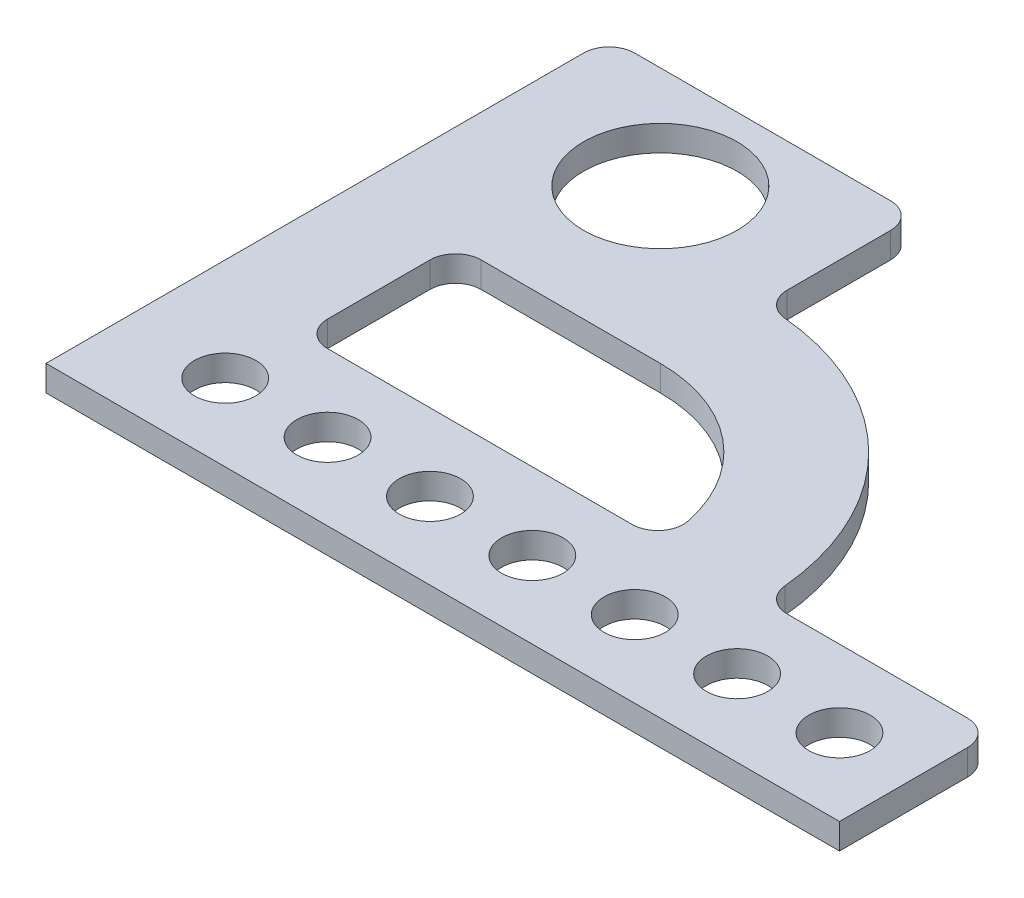
ISO-10303-21;
HEADER;
FILE_DESCRIPTION(('STEP AP214'),'2;1');
FILE_NAME('part.step','',(''),(''),'','','');
FILE_SCHEMA(('AUTOMOTIVE_DESIGN { 1 0 10303 214 1 1 1 1 }'));
ENDSEC;
DATA;
#1=APPLICATION_CONTEXT('core data for automotive mechanical design processes');
#2=APPLICATION_PROTOCOL_DEFINITION('international standard','automotive_design',2000,#1);
#3=PRODUCT_CONTEXT('',#1,'mechanical');
#4=PRODUCT('Part','Part','',(#3));
#5=PRODUCT_RELATED_PRODUCT_CATEGORY('part','',(#4));
#6=PRODUCT_DEFINITION_FORMATION('','',#4);
#7=PRODUCT_DEFINITION_CONTEXT('part definition',#1,'design');
#8=PRODUCT_DEFINITION('design','',#6,#7);
#9=PRODUCT_DEFINITION_SHAPE('','',#8);
#10=(LENGTH_UNIT() NAMED_UNIT(*) SI_UNIT(.MILLI.,.METRE.));
#11=(NAMED_UNIT(*) PLANE_ANGLE_UNIT() SI_UNIT($,.RADIAN.));
#12=(NAMED_UNIT(*) SI_UNIT($,.STERADIAN.) SOLID_ANGLE_UNIT());
#13=UNCERTAINTY_MEASURE_WITH_UNIT(LENGTH_MEASURE(1.E-05),#10,'distance_accuracy_value','');
#14=(GEOMETRIC_REPRESENTATION_CONTEXT(3) GLOBAL_UNCERTAINTY_ASSIGNED_CONTEXT((#13)) GLOBAL_UNIT_ASSIGNED_CONTEXT((#10,
#11,#12)) REPRESENTATION_CONTEXT('',''));
#15=CARTESIAN_POINT('',(0.,0.,0.));
#16=DIRECTION('',(0.,0.,1.));
#17=DIRECTION('',(1.,0.,0.));
#18=AXIS2_PLACEMENT_3D('',#15,#16,#17);
#19=CARTESIAN_POINT('',(0.,5.,-30.));
#20=DIRECTION('',(0.,0.,-1.));
#21=DIRECTION('',(-1.,0.,0.));
#22=AXIS2_PLACEMENT_3D('',#19,#20,#21);
#23=PLANE('',#22);
#24=DIRECTION('',(1.,0.,0.));
#25=VECTOR('',#24,1.);
#26=CARTESIAN_POINT('',(0.,0.,-30.));
#27=LINE('',#26,#25);
#28=CARTESIAN_POINT('',(114.772255750517,0.,-30.));
#29=VERTEX_POINT('',#28);
#30=CARTESIAN_POINT('',(150.,0.,-30.));
#31=VERTEX_POINT('',#30);
#32=EDGE_CURVE('E272',#29,#31,#27,.T.);
#33=ORIENTED_EDGE('',*,*,#32,.F.);
#34=DIRECTION('',(0.,-1.,0.));
#35=VECTOR('',#34,1.);
#36=CARTESIAN_POINT('',(114.772255750517,5.,-30.));
#37=LINE('',#36,#35);
#38=CARTESIAN_POINT('',(114.772255750517,5.,-30.));
#39=VERTEX_POINT('',#38);
#40=EDGE_CURVE('E11',#39,#29,#37,.T.);
#41=ORIENTED_EDGE('',*,*,#40,.F.);
#42=DIRECTION('',(1.,0.,0.));
#43=VECTOR('',#42,1.);
#44=CARTESIAN_POINT('',(0.,5.,-30.));
#45=LINE('',#44,#43);
#46=CARTESIAN_POINT('',(150.,5.,-30.));
#47=VERTEX_POINT('',#46);
#48=EDGE_CURVE('E687',#39,#47,#45,.T.);
#49=ORIENTED_EDGE('',*,*,#48,.T.);
#50=DIRECTION('',(0.,-1.,0.));
#51=VECTOR('',#50,1.);
#52=CARTESIAN_POINT('',(150.,5.,-30.));
#53=LINE('',#52,#51);
#54=EDGE_CURVE('E128',#47,#31,#53,.T.);
#55=ORIENTED_EDGE('',*,*,#54,.T.);
#56=EDGE_LOOP('',(#33,#41,#49,#55));
#57=FACE_BOUND('',#56,.T.);
#58=ADVANCED_FACE('F41',(#57),#23,.T.);
#59=CARTESIAN_POINT('',(114.772255750517,5.,-35.));
#60=DIRECTION('',(0.,-1.,0.));
#61=DIRECTION('',(0.,0.,-1.));
#62=AXIS2_PLACEMENT_3D('',#59,#60,#61);
#63=CYLINDRICAL_SURFACE('',#62,5.);
#64=CARTESIAN_POINT('',(114.772255750517,0.,-35.));
#65=DIRECTION('',(0.,1.,0.));
#66=DIRECTION('',(0.,0.,1.));
#67=AXIS2_PLACEMENT_3D('',#64,#65,#66);
#68=CIRCLE('',#67,5.);
#69=CARTESIAN_POINT('',(109.792959773197,0.,-34.5454545454545));
#70=VERTEX_POINT('',#69);
#71=EDGE_CURVE('E276',#29,#70,#68,.F.);
#72=ORIENTED_EDGE('',*,*,#71,.T.);
#73=DIRECTION('',(0.,-1.,0.));
#74=VECTOR('',#73,1.);
#75=CARTESIAN_POINT('',(109.792959773197,5.,-34.5454545454545));
#76=LINE('',#75,#74);
#77=CARTESIAN_POINT('',(109.792959773197,5.,-34.5454545454545));
#78=VERTEX_POINT('',#77);
#79=EDGE_CURVE('E52',#78,#70,#76,.T.);
#80=ORIENTED_EDGE('',*,*,#79,.F.);
#81=CARTESIAN_POINT('',(114.772255750517,5.,-35.));
#82=DIRECTION('',(0.,1.,0.));
#83=DIRECTION('',(0.,0.,1.));
#84=AXIS2_PLACEMENT_3D('',#81,#82,#83);
#85=CIRCLE('',#84,5.);
#86=EDGE_CURVE('E683',#39,#78,#85,.F.);
#87=ORIENTED_EDGE('',*,*,#86,.F.);
#88=ORIENTED_EDGE('',*,*,#40,.T.);
#89=EDGE_LOOP('',(#72,#80,#87,#88));
#90=FACE_BOUND('',#89,.T.);
#91=ADVANCED_FACE('F405',(#90),#63,.F.);
#92=CARTESIAN_POINT('',(60.,5.,-30.));
#93=DIRECTION('',(0.,-1.,0.));
#94=DIRECTION('',(0.,0.,-1.));
#95=AXIS2_PLACEMENT_3D('',#92,#93,#94);
#96=CYLINDRICAL_SURFACE('',#95,50.);
#97=CARTESIAN_POINT('',(60.,0.,-30.));
#98=DIRECTION('',(0.,1.,0.));
#99=DIRECTION('',(0.,0.,1.));
#100=AXIS2_PLACEMENT_3D('',#97,#98,#99);
#101=CIRCLE('',#100,50.);
#102=CARTESIAN_POINT('',(64.5454545454545,0.,-79.7929597731969));
#103=VERTEX_POINT('',#102);
#104=EDGE_CURVE('E280',#103,#70,#101,.F.);
#105=ORIENTED_EDGE('',*,*,#104,.F.);
#106=DIRECTION('',(0.,-1.,0.));
#107=VECTOR('',#106,1.);
#108=CARTESIAN_POINT('',(64.5454545454545,5.,-79.7929597731969));
#109=LINE('',#108,#107);
#110=CARTESIAN_POINT('',(64.5454545454545,5.,-79.7929597731969));
#111=VERTEX_POINT('',#110);
#112=EDGE_CURVE('E339',#111,#103,#109,.T.);
#113=ORIENTED_EDGE('',*,*,#112,.F.);
#114=CARTESIAN_POINT('',(60.,5.,-30.));
#115=DIRECTION('',(0.,1.,0.));
#116=DIRECTION('',(0.,0.,1.));
#117=AXIS2_PLACEMENT_3D('',#114,#115,#116);
#118=CIRCLE('',#117,50.);
#119=EDGE_CURVE('E680',#111,#78,#118,.F.);
#120=ORIENTED_EDGE('',*,*,#119,.T.);
#121=ORIENTED_EDGE('',*,*,#79,.T.);
#122=EDGE_LOOP('',(#105,#113,#120,#121));
#123=FACE_BOUND('',#122,.T.);
#124=ADVANCED_FACE('F410',(#123),#96,.T.);
#125=CARTESIAN_POINT('',(65.,5.,-84.7722557505166));
#126=DIRECTION('',(0.,-1.,0.));
#127=DIRECTION('',(0.,0.,-1.));
#128=AXIS2_PLACEMENT_3D('',#125,#126,#127);
#129=CYLINDRICAL_SURFACE('',#128,5.);
#130=CARTESIAN_POINT('',(65.,0.,-84.7722557505166));
#131=DIRECTION('',(0.,1.,0.));
#132=DIRECTION('',(0.,0.,1.));
#133=AXIS2_PLACEMENT_3D('',#130,#131,#132);
#134=CIRCLE('',#133,5.);
#135=CARTESIAN_POINT('',(60.,0.,-84.7722557505166));
#136=VERTEX_POINT('',#135);
#137=EDGE_CURVE('E284',#103,#136,#134,.F.);
#138=ORIENTED_EDGE('',*,*,#137,.T.);
#139=DIRECTION('',(0.,-1.,0.));
#140=VECTOR('',#139,1.);
#141=CARTESIAN_POINT('',(60.,5.,-84.7722557505166));
#142=LINE('',#141,#140);
#143=CARTESIAN_POINT('',(60.,5.,-84.7722557505166));
#144=VERTEX_POINT('',#143);
#145=EDGE_CURVE('E335',#144,#136,#142,.T.);
#146=ORIENTED_EDGE('',*,*,#145,.F.);
#147=CARTESIAN_POINT('',(65.,5.,-84.7722557505166));
#148=DIRECTION('',(0.,1.,0.));
#149=DIRECTION('',(0.,0.,1.));
#150=AXIS2_PLACEMENT_3D('',#147,#148,#149);
#151=CIRCLE('',#150,5.);
#152=EDGE_CURVE('E676',#111,#144,#151,.F.);
#153=ORIENTED_EDGE('',*,*,#152,.F.);
#154=ORIENTED_EDGE('',*,*,#112,.T.);
#155=EDGE_LOOP('',(#138,#146,#153,#154));
#156=FACE_BOUND('',#155,.T.);
#157=ADVANCED_FACE('F628',(#156),#129,.F.);
#158=CARTESIAN_POINT('',(60.,5.,0.));
#159=DIRECTION('',(-1.,0.,0.));
#160=DIRECTION('',(0.,0.,1.));
#161=AXIS2_PLACEMENT_3D('',#158,#159,#160);
#162=PLANE('',#161);
#163=DIRECTION('',(0.,0.,-1.));
#164=VECTOR('',#163,1.);
#165=CARTESIAN_POINT('',(60.,0.,0.));
#166=LINE('',#165,#164);
#167=CARTESIAN_POINT('',(60.,0.,-105.));
#168=VERTEX_POINT('',#167);
#169=EDGE_CURVE('E288',#136,#168,#166,.T.);
#170=ORIENTED_EDGE('',*,*,#169,.T.);
#171=DIRECTION('',(0.,-1.,0.));
#172=VECTOR('',#171,1.);
#173=CARTESIAN_POINT('',(60.,5.,-105.));
#174=LINE('',#173,#172);
#175=CARTESIAN_POINT('',(60.,5.,-105.));
#176=VERTEX_POINT('',#175);
#177=EDGE_CURVE('E332',#176,#168,#174,.T.);
#178=ORIENTED_EDGE('',*,*,#177,.F.);
#179=DIRECTION('',(0.,0.,-1.));
#180=VECTOR('',#179,1.);
#181=CARTESIAN_POINT('',(60.,5.,0.));
#182=LINE('',#181,#180);
#183=EDGE_CURVE('E679',#144,#176,#182,.T.);
#184=ORIENTED_EDGE('',*,*,#183,.F.);
#185=ORIENTED_EDGE('',*,*,#145,.T.);
#186=EDGE_LOOP('',(#170,#178,#184,#185));
#187=FACE_BOUND('',#186,.T.);
#188=ADVANCED_FACE('F619',(#187),#162,.F.);
#189=CARTESIAN_POINT('',(55.,5.,-105.));
#190=DIRECTION('',(0.,-1.,0.));
#191=DIRECTION('',(0.,0.,-1.));
#192=AXIS2_PLACEMENT_3D('',#189,#190,#191);
#193=CYLINDRICAL_SURFACE('',#192,5.00000000000001);
#194=CARTESIAN_POINT('',(55.,0.,-105.));
#195=DIRECTION('',(0.,1.,0.));
#196=DIRECTION('',(0.,0.,1.));
#197=AXIS2_PLACEMENT_3D('',#194,#195,#196);
#198=CIRCLE('',#197,5.00000000000001);
#199=CARTESIAN_POINT('',(55.,0.,-110.));
#200=VERTEX_POINT('',#199);
#201=EDGE_CURVE('E292',#200,#168,#198,.F.);
#202=ORIENTED_EDGE('',*,*,#201,.F.);
#203=DIRECTION('',(0.,-1.,0.));
#204=VECTOR('',#203,1.);
#205=CARTESIAN_POINT('',(55.,5.,-110.));
#206=LINE('',#205,#204);
#207=CARTESIAN_POINT('',(55.,5.,-110.));
#208=VERTEX_POINT('',#207);
#209=EDGE_CURVE('E329',#208,#200,#206,.T.);
#210=ORIENTED_EDGE('',*,*,#209,.F.);
#211=CARTESIAN_POINT('',(55.,5.,-105.));
#212=DIRECTION('',(0.,1.,0.));
#213=DIRECTION('',(0.,0.,1.));
#214=AXIS2_PLACEMENT_3D('',#211,#212,#213);
#215=CIRCLE('',#214,5.00000000000001);
#216=EDGE_CURVE('E693',#208,#176,#215,.F.);
#217=ORIENTED_EDGE('',*,*,#216,.T.);
#218=ORIENTED_EDGE('',*,*,#177,.T.);
#219=EDGE_LOOP('',(#202,#210,#217,#218));
#220=FACE_BOUND('',#219,.T.);
#221=ADVANCED_FACE('F610',(#220),#193,.T.);
#222=CARTESIAN_POINT('',(0.,5.,-110.));
#223=DIRECTION('',(0.,0.,-1.));
#224=DIRECTION('',(-1.,0.,0.));
#225=AXIS2_PLACEMENT_3D('',#222,#223,#224);
#226=PLANE('',#225);
#227=DIRECTION('',(1.,0.,0.));
#228=VECTOR('',#227,1.);
#229=CARTESIAN_POINT('',(0.,0.,-110.));
#230=LINE('',#229,#228);
#231=CARTESIAN_POINT('',(5.,0.,-110.));
#232=VERTEX_POINT('',#231);
#233=EDGE_CURVE('E296',#232,#200,#230,.T.);
#234=ORIENTED_EDGE('',*,*,#233,.F.);
#235=DIRECTION('',(0.,-1.,0.));
#236=VECTOR('',#235,1.);
#237=CARTESIAN_POINT('',(5.,5.,-110.));
#238=LINE('',#237,#236);
#239=CARTESIAN_POINT('',(5.,5.,-110.));
#240=VERTEX_POINT('',#239);
#241=EDGE_CURVE('E326',#240,#232,#238,.T.);
#242=ORIENTED_EDGE('',*,*,#241,.F.);
#243=DIRECTION('',(1.,0.,0.));
#244=VECTOR('',#243,1.);
#245=CARTESIAN_POINT('',(0.,5.,-110.));
#246=LINE('',#245,#244);
#247=EDGE_CURVE('E697',#240,#208,#246,.T.);
#248=ORIENTED_EDGE('',*,*,#247,.T.);
#249=ORIENTED_EDGE('',*,*,#209,.T.);
#250=EDGE_LOOP('',(#234,#242,#248,#249));
#251=FACE_BOUND('',#250,.T.);
#252=ADVANCED_FACE('F601',(#251),#226,.T.);
#253=CARTESIAN_POINT('',(5.,5.,-105.));
#254=DIRECTION('',(0.,-1.,0.));
#255=DIRECTION('',(0.,0.,-1.));
#256=AXIS2_PLACEMENT_3D('',#253,#254,#255);
#257=CYLINDRICAL_SURFACE('',#256,5.);
#258=CARTESIAN_POINT('',(5.,0.,-105.));
#259=DIRECTION('',(0.,1.,0.));
#260=DIRECTION('',(0.,0.,1.));
#261=AXIS2_PLACEMENT_3D('',#258,#259,#260);
#262=CIRCLE('',#261,5.);
#263=CARTESIAN_POINT('',(0.,0.,-105.));
#264=VERTEX_POINT('',#263);
#265=EDGE_CURVE('E300',#264,#232,#262,.F.);
#266=ORIENTED_EDGE('',*,*,#265,.F.);
#267=DIRECTION('',(0.,-1.,0.));
#268=VECTOR('',#267,1.);
#269=CARTESIAN_POINT('',(0.,5.,-105.));
#270=LINE('',#269,#268);
#271=CARTESIAN_POINT('',(0.,5.,-105.));
#272=VERTEX_POINT('',#271);
#273=EDGE_CURVE('E323',#272,#264,#270,.T.);
#274=ORIENTED_EDGE('',*,*,#273,.F.);
#275=CARTESIAN_POINT('',(5.,5.,-105.));
#276=DIRECTION('',(0.,1.,0.));
#277=DIRECTION('',(0.,0.,1.));
#278=AXIS2_PLACEMENT_3D('',#275,#276,#277);
#279=CIRCLE('',#278,5.);
#280=EDGE_CURVE('E701',#272,#240,#279,.F.);
#281=ORIENTED_EDGE('',*,*,#280,.T.);
#282=ORIENTED_EDGE('',*,*,#241,.T.);
#283=EDGE_LOOP('',(#266,#274,#281,#282));
#284=FACE_BOUND('',#283,.T.);
#285=ADVANCED_FACE('F592',(#284),#257,.T.);
#286=CARTESIAN_POINT('',(0.,5.,0.));
#287=DIRECTION('',(1.,0.,0.));
#288=DIRECTION('',(0.,0.,-1.));
#289=AXIS2_PLACEMENT_3D('',#286,#287,#288);
#290=PLANE('',#289);
#291=DIRECTION('',(0.,0.,1.));
#292=VECTOR('',#291,1.);
#293=CARTESIAN_POINT('',(0.,0.,0.));
#294=LINE('',#293,#292);
#295=CARTESIAN_POINT('',(0.,0.,0.));
#296=VERTEX_POINT('',#295);
#297=EDGE_CURVE('E304',#264,#296,#294,.T.);
#298=ORIENTED_EDGE('',*,*,#297,.T.);
#299=DIRECTION('',(0.,-1.,0.));
#300=VECTOR('',#299,1.);
#301=CARTESIAN_POINT('',(0.,5.,0.));
#302=LINE('',#301,#300);
#303=CARTESIAN_POINT('',(0.,5.,0.));
#304=VERTEX_POINT('',#303);
#305=EDGE_CURVE('E203',#304,#296,#302,.T.);
#306=ORIENTED_EDGE('',*,*,#305,.F.);
#307=DIRECTION('',(0.,0.,1.));
#308=VECTOR('',#307,1.);
#309=CARTESIAN_POINT('',(0.,5.,0.));
#310=LINE('',#309,#308);
#311=EDGE_CURVE('E189',#272,#304,#310,.T.);
#312=ORIENTED_EDGE('',*,*,#311,.F.);
#313=ORIENTED_EDGE('',*,*,#273,.T.);
#314=EDGE_LOOP('',(#298,#306,#312,#313));
#315=FACE_BOUND('',#314,.T.);
#316=ADVANCED_FACE('F584',(#315),#290,.F.);
#317=CARTESIAN_POINT('',(0.,5.,0.));
#318=DIRECTION('',(0.,0.,-1.));
#319=DIRECTION('',(-1.,0.,0.));
#320=AXIS2_PLACEMENT_3D('',#317,#318,#319);
#321=PLANE('',#320);
#322=DIRECTION('',(1.,0.,0.));
#323=VECTOR('',#322,1.);
#324=CARTESIAN_POINT('',(0.,0.,0.));
#325=LINE('',#324,#323);
#326=CARTESIAN_POINT('',(155.,0.,0.));
#327=VERTEX_POINT('',#326);
#328=EDGE_CURVE('E198',#296,#327,#325,.T.);
#329=ORIENTED_EDGE('',*,*,#328,.T.);
#330=DIRECTION('',(0.,-1.,0.));
#331=VECTOR('',#330,1.);
#332=CARTESIAN_POINT('',(155.,5.,0.));
#333=LINE('',#332,#331);
#334=CARTESIAN_POINT('',(155.,5.,0.));
#335=VERTEX_POINT('',#334);
#336=EDGE_CURVE('E196',#335,#327,#333,.T.);
#337=ORIENTED_EDGE('',*,*,#336,.F.);
#338=DIRECTION('',(1.,0.,0.));
#339=VECTOR('',#338,1.);
#340=CARTESIAN_POINT('',(0.,5.,0.));
#341=LINE('',#340,#339);
#342=EDGE_CURVE('E182',#304,#335,#341,.T.);
#343=ORIENTED_EDGE('',*,*,#342,.F.);
#344=ORIENTED_EDGE('',*,*,#305,.T.);
#345=EDGE_LOOP('',(#329,#337,#343,#344));
#346=FACE_BOUND('',#345,.T.);
#347=ADVANCED_FACE('F197',(#346),#321,.F.);
#348=CARTESIAN_POINT('',(155.,5.,0.));
#349=DIRECTION('',(1.,0.,0.));
#350=DIRECTION('',(0.,0.,-1.));
#351=AXIS2_PLACEMENT_3D('',#348,#349,#350);
#352=PLANE('',#351);
#353=DIRECTION('',(0.,0.,1.));
#354=VECTOR('',#353,1.);
#355=CARTESIAN_POINT('',(155.,0.,0.));
#356=LINE('',#355,#354);
#357=CARTESIAN_POINT('',(155.,0.,-25.));
#358=VERTEX_POINT('',#357);
#359=EDGE_CURVE('E310',#358,#327,#356,.T.);
#360=ORIENTED_EDGE('',*,*,#359,.F.);
#361=DIRECTION('',(0.,-1.,0.));
#362=VECTOR('',#361,1.);
#363=CARTESIAN_POINT('',(155.,5.,-25.));
#364=LINE('',#363,#362);
#365=CARTESIAN_POINT('',(155.,5.,-25.));
#366=VERTEX_POINT('',#365);
#367=EDGE_CURVE('E121',#366,#358,#364,.T.);
#368=ORIENTED_EDGE('',*,*,#367,.F.);
#369=DIRECTION('',(0.,0.,1.));
#370=VECTOR('',#369,1.);
#371=CARTESIAN_POINT('',(155.,5.,0.));
#372=LINE('',#371,#370);
#373=EDGE_CURVE('E186',#366,#335,#372,.T.);
#374=ORIENTED_EDGE('',*,*,#373,.T.);
#375=ORIENTED_EDGE('',*,*,#336,.T.);
#376=EDGE_LOOP('',(#360,#368,#374,#375));
#377=FACE_BOUND('',#376,.T.);
#378=ADVANCED_FACE('F205',(#377),#352,.T.);
#379=CARTESIAN_POINT('',(20.,5.,0.));
#380=DIRECTION('',(1.,0.,0.));
#381=DIRECTION('',(0.,0.,-1.));
#382=AXIS2_PLACEMENT_3D('',#379,#380,#381);
#383=PLANE('',#382);
#384=DIRECTION('',(0.,0.,1.));
#385=VECTOR('',#384,1.);
#386=CARTESIAN_POINT('',(20.,0.,0.));
#387=LINE('',#386,#385);
#388=CARTESIAN_POINT('',(20.,0.,-55.));
#389=VERTEX_POINT('',#388);
#390=CARTESIAN_POINT('',(20.,0.,-35.));
#391=VERTEX_POINT('',#390);
#392=EDGE_CURVE('E213',#389,#391,#387,.T.);
#393=ORIENTED_EDGE('',*,*,#392,.F.);
#394=DIRECTION('',(0.,-1.,0.));
#395=VECTOR('',#394,1.);
#396=CARTESIAN_POINT('',(20.,5.,-55.));
#397=LINE('',#396,#395);
#398=CARTESIAN_POINT('',(20.,5.,-55.));
#399=VERTEX_POINT('',#398);
#400=EDGE_CURVE('E45',#399,#389,#397,.T.);
#401=ORIENTED_EDGE('',*,*,#400,.F.);
#402=DIRECTION('',(0.,0.,1.));
#403=VECTOR('',#402,1.);
#404=CARTESIAN_POINT('',(20.,5.,0.));
#405=LINE('',#404,#403);
#406=CARTESIAN_POINT('',(20.,5.,-35.));
#407=VERTEX_POINT('',#406);
#408=EDGE_CURVE('E316',#399,#407,#405,.T.);
#409=ORIENTED_EDGE('',*,*,#408,.T.);
#410=DIRECTION('',(0.,-1.,0.));
#411=VECTOR('',#410,1.);
#412=CARTESIAN_POINT('',(20.,5.,-35.));
#413=LINE('',#412,#411);
#414=EDGE_CURVE('E209',#407,#391,#413,.T.);
#415=ORIENTED_EDGE('',*,*,#414,.T.);
#416=EDGE_LOOP('',(#393,#401,#409,#415));
#417=FACE_BOUND('',#416,.T.);
#418=ADVANCED_FACE('F43',(#417),#383,.T.);
#419=CARTESIAN_POINT('',(25.,5.,-55.));
#420=DIRECTION('',(0.,-1.,0.));
#421=DIRECTION('',(0.,0.,-1.));
#422=AXIS2_PLACEMENT_3D('',#419,#420,#421);
#423=CYLINDRICAL_SURFACE('',#422,5.);
#424=CARTESIAN_POINT('',(25.,0.,-55.));
#425=DIRECTION('',(0.,1.,0.));
#426=DIRECTION('',(0.,0.,1.));
#427=AXIS2_PLACEMENT_3D('',#424,#425,#426);
#428=CIRCLE('',#427,5.);
#429=CARTESIAN_POINT('',(25.,0.,-60.));
#430=VERTEX_POINT('',#429);
#431=EDGE_CURVE('E217',#389,#430,#428,.F.);
#432=ORIENTED_EDGE('',*,*,#431,.T.);
#433=DIRECTION('',(0.,-1.,0.));
#434=VECTOR('',#433,1.);
#435=CARTESIAN_POINT('',(25.,5.,-60.));
#436=LINE('',#435,#434);
#437=CARTESIAN_POINT('',(25.,5.,-60.));
#438=VERTEX_POINT('',#437);
#439=EDGE_CURVE('E357',#438,#430,#436,.T.);
#440=ORIENTED_EDGE('',*,*,#439,.F.);
#441=CARTESIAN_POINT('',(25.,5.,-55.));
#442=DIRECTION('',(0.,1.,0.));
#443=DIRECTION('',(0.,0.,1.));
#444=AXIS2_PLACEMENT_3D('',#441,#442,#443);
#445=CIRCLE('',#444,5.);
#446=EDGE_CURVE('E368',#399,#438,#445,.F.);
#447=ORIENTED_EDGE('',*,*,#446,.F.);
#448=ORIENTED_EDGE('',*,*,#400,.T.);
#449=EDGE_LOOP('',(#432,#440,#447,#448));
#450=FACE_BOUND('',#449,.T.);
#451=ADVANCED_FACE('F367',(#450),#423,.F.);
#452=CARTESIAN_POINT('',(0.,5.,-60.));
#453=DIRECTION('',(0.,0.,-1.));
#454=DIRECTION('',(-1.,0.,0.));
#455=AXIS2_PLACEMENT_3D('',#452,#453,#454);
#456=PLANE('',#455);
#457=DIRECTION('',(1.,0.,0.));
#458=VECTOR('',#457,1.);
#459=CARTESIAN_POINT('',(0.,0.,-60.));
#460=LINE('',#459,#458);
#461=CARTESIAN_POINT('',(60.,0.,-60.));
#462=VERTEX_POINT('',#461);
#463=EDGE_CURVE('E220',#430,#462,#460,.T.);
#464=ORIENTED_EDGE('',*,*,#463,.T.);
#465=DIRECTION('',(0.,-1.,0.));
#466=VECTOR('',#465,1.);
#467=CARTESIAN_POINT('',(60.,5.,-60.));
#468=LINE('',#467,#466);
#469=CARTESIAN_POINT('',(60.,5.,-60.));
#470=VERTEX_POINT('',#469);
#471=EDGE_CURVE('E355',#470,#462,#468,.T.);
#472=ORIENTED_EDGE('',*,*,#471,.F.);
#473=DIRECTION('',(1.,0.,0.));
#474=VECTOR('',#473,1.);
#475=CARTESIAN_POINT('',(0.,5.,-60.));
#476=LINE('',#475,#474);
#477=EDGE_CURVE('E755',#438,#470,#476,.T.);
#478=ORIENTED_EDGE('',*,*,#477,.F.);
#479=ORIENTED_EDGE('',*,*,#439,.T.);
#480=EDGE_LOOP('',(#464,#472,#478,#479));
#481=FACE_BOUND('',#480,.T.);
#482=ADVANCED_FACE('F396',(#481),#456,.F.);
#483=CARTESIAN_POINT('',(60.,5.,-30.));
#484=DIRECTION('',(0.,-1.,0.));
#485=DIRECTION('',(0.,0.,-1.));
#486=AXIS2_PLACEMENT_3D('',#483,#484,#485);
#487=CYLINDRICAL_SURFACE('',#486,30.);
#488=CARTESIAN_POINT('',(60.,0.,-30.));
#489=DIRECTION('',(0.,1.,0.));
#490=DIRECTION('',(0.,0.,1.));
#491=AXIS2_PLACEMENT_3D('',#488,#489,#490);
#492=CIRCLE('',#491,30.);
#493=CARTESIAN_POINT('',(89.3938769133981,0.,-36.));
#494=VERTEX_POINT('',#493);
#495=EDGE_CURVE('E224',#494,#462,#492,.T.);
#496=ORIENTED_EDGE('',*,*,#495,.F.);
#497=DIRECTION('',(0.,-1.,0.));
#498=VECTOR('',#497,1.);
#499=CARTESIAN_POINT('',(89.3938769133981,5.,-36.));
#500=LINE('',#499,#498);
#501=CARTESIAN_POINT('',(89.3938769133981,5.,-36.));
#502=VERTEX_POINT('',#501);
#503=EDGE_CURVE('E352',#502,#494,#500,.T.);
#504=ORIENTED_EDGE('',*,*,#503,.F.);
#505=CARTESIAN_POINT('',(60.,5.,-30.));
#506=DIRECTION('',(0.,1.,0.));
#507=DIRECTION('',(0.,0.,1.));
#508=AXIS2_PLACEMENT_3D('',#505,#506,#507);
#509=CIRCLE('',#508,30.);
#510=EDGE_CURVE('E395',#502,#470,#509,.T.);
#511=ORIENTED_EDGE('',*,*,#510,.T.);
#512=ORIENTED_EDGE('',*,*,#471,.T.);
#513=EDGE_LOOP('',(#496,#504,#511,#512));
#514=FACE_BOUND('',#513,.T.);
#515=ADVANCED_FACE('F391',(#514),#487,.F.);
#516=CARTESIAN_POINT('',(84.4948974278318,5.,-35.));
#517=DIRECTION('',(0.,-1.,0.));
#518=DIRECTION('',(0.,0.,-1.));
#519=AXIS2_PLACEMENT_3D('',#516,#517,#518);
#520=CYLINDRICAL_SURFACE('',#519,5.);
#521=CARTESIAN_POINT('',(84.4948974278318,0.,-35.));
#522=DIRECTION('',(0.,1.,0.));
#523=DIRECTION('',(0.,0.,1.));
#524=AXIS2_PLACEMENT_3D('',#521,#522,#523);
#525=CIRCLE('',#524,5.);
#526=CARTESIAN_POINT('',(84.4948974278318,0.,-30.));
#527=VERTEX_POINT('',#526);
#528=EDGE_CURVE('E228',#527,#494,#525,.T.);
#529=ORIENTED_EDGE('',*,*,#528,.F.);
#530=DIRECTION('',(0.,-1.,0.));
#531=VECTOR('',#530,1.);
#532=CARTESIAN_POINT('',(84.4948974278318,5.,-30.));
#533=LINE('',#532,#531);
#534=CARTESIAN_POINT('',(84.4948974278318,5.,-30.));
#535=VERTEX_POINT('',#534);
#536=EDGE_CURVE('E349',#535,#527,#533,.T.);
#537=ORIENTED_EDGE('',*,*,#536,.F.);
#538=CARTESIAN_POINT('',(84.4948974278318,5.,-35.));
#539=DIRECTION('',(0.,1.,0.));
#540=DIRECTION('',(0.,0.,1.));
#541=AXIS2_PLACEMENT_3D('',#538,#539,#540);
#542=CIRCLE('',#541,5.);
#543=EDGE_CURVE('E750',#535,#502,#542,.T.);
#544=ORIENTED_EDGE('',*,*,#543,.T.);
#545=ORIENTED_EDGE('',*,*,#503,.T.);
#546=EDGE_LOOP('',(#529,#537,#544,#545));
#547=FACE_BOUND('',#546,.T.);
#548=ADVANCED_FACE('F388',(#547),#520,.F.);
#549=CARTESIAN_POINT('',(0.,5.,-30.));
#550=DIRECTION('',(0.,0.,-1.));
#551=DIRECTION('',(-1.,0.,0.));
#552=AXIS2_PLACEMENT_3D('',#549,#550,#551);
#553=PLANE('',#552);
#554=DIRECTION('',(1.,0.,0.));
#555=VECTOR('',#554,1.);
#556=CARTESIAN_POINT('',(0.,0.,-30.));
#557=LINE('',#556,#555);
#558=CARTESIAN_POINT('',(25.,0.,-30.));
#559=VERTEX_POINT('',#558);
#560=EDGE_CURVE('E232',#559,#527,#557,.T.);
#561=ORIENTED_EDGE('',*,*,#560,.F.);
#562=DIRECTION('',(0.,-1.,0.));
#563=VECTOR('',#562,1.);
#564=CARTESIAN_POINT('',(25.,5.,-30.));
#565=LINE('',#564,#563);
#566=CARTESIAN_POINT('',(25.,5.,-30.));
#567=VERTEX_POINT('',#566);
#568=EDGE_CURVE('E346',#567,#559,#565,.T.);
#569=ORIENTED_EDGE('',*,*,#568,.F.);
#570=DIRECTION('',(1.,0.,0.));
#571=VECTOR('',#570,1.);
#572=CARTESIAN_POINT('',(0.,5.,-30.));
#573=LINE('',#572,#571);
#574=EDGE_CURVE('E384',#567,#535,#573,.T.);
#575=ORIENTED_EDGE('',*,*,#574,.T.);
#576=ORIENTED_EDGE('',*,*,#536,.T.);
#577=EDGE_LOOP('',(#561,#569,#575,#576));
#578=FACE_BOUND('',#577,.T.);
#579=ADVANCED_FACE('F380',(#578),#553,.T.);
#580=CARTESIAN_POINT('',(140.,5.,-15.));
#581=DIRECTION('',(0.,-1.,0.));
#582=DIRECTION('',(0.,0.,-1.));
#583=AXIS2_PLACEMENT_3D('',#580,#581,#582);
#584=CYLINDRICAL_SURFACE('',#583,6.00000000000002);
#585=CARTESIAN_POINT('',(140.,5.,-15.));
#586=DIRECTION('',(0.,1.,0.));
#587=DIRECTION('',(0.,0.,1.));
#588=AXIS2_PLACEMENT_3D('',#585,#586,#587);
#589=CIRCLE('',#588,6.00000000000002);
#590=CARTESIAN_POINT('',(140.,5.,-8.99999999999998));
#591=VERTEX_POINT('',#590);
#592=EDGE_CURVE('E712',#591,#591,#589,.T.);
#593=ORIENTED_EDGE('',*,*,#592,.T.);
#594=EDGE_LOOP('',(#593));
#595=FACE_BOUND('',#594,.T.);
#596=CARTESIAN_POINT('',(140.,0.,-15.));
#597=DIRECTION('',(0.,1.,0.));
#598=DIRECTION('',(0.,0.,1.));
#599=AXIS2_PLACEMENT_3D('',#596,#597,#598);
#600=CIRCLE('',#599,6.00000000000002);
#601=CARTESIAN_POINT('',(140.,0.,-8.99999999999998));
#602=VERTEX_POINT('',#601);
#603=EDGE_CURVE('E268',#602,#602,#600,.T.);
#604=ORIENTED_EDGE('',*,*,#603,.F.);
#605=EDGE_LOOP('',(#604));
#606=FACE_BOUND('',#605,.T.);
#607=ADVANCED_FACE('F415',(#595,#606),#584,.F.);
#608=CARTESIAN_POINT('',(120.,5.,-15.));
#609=DIRECTION('',(0.,-1.,0.));
#610=DIRECTION('',(0.,0.,-1.));
#611=AXIS2_PLACEMENT_3D('',#608,#609,#610);
#612=CYLINDRICAL_SURFACE('',#611,6.00000000000003);
#613=CARTESIAN_POINT('',(120.,5.,-15.));
#614=DIRECTION('',(0.,1.,0.));
#615=DIRECTION('',(0.,0.,1.));
#616=AXIS2_PLACEMENT_3D('',#613,#614,#615);
#617=CIRCLE('',#616,6.00000000000003);
#618=CARTESIAN_POINT('',(120.,5.,-8.99999999999997));
#619=VERTEX_POINT('',#618);
#620=EDGE_CURVE('E715',#619,#619,#617,.T.);
#621=ORIENTED_EDGE('',*,*,#620,.T.);
#622=EDGE_LOOP('',(#621));
#623=FACE_BOUND('',#622,.T.);
#624=CARTESIAN_POINT('',(120.,0.,-15.));
#625=DIRECTION('',(0.,1.,0.));
#626=DIRECTION('',(0.,0.,1.));
#627=AXIS2_PLACEMENT_3D('',#624,#625,#626);
#628=CIRCLE('',#627,6.00000000000003);
#629=CARTESIAN_POINT('',(120.,0.,-8.99999999999997));
#630=VERTEX_POINT('',#629);
#631=EDGE_CURVE('E264',#630,#630,#628,.T.);
#632=ORIENTED_EDGE('',*,*,#631,.F.);
#633=EDGE_LOOP('',(#632));
#634=FACE_BOUND('',#633,.T.);
#635=ADVANCED_FACE('F418',(#623,#634),#612,.F.);
#636=CARTESIAN_POINT('',(100.,5.,-15.));
#637=DIRECTION('',(0.,-1.,0.));
#638=DIRECTION('',(0.,0.,-1.));
#639=AXIS2_PLACEMENT_3D('',#636,#637,#638);
#640=CYLINDRICAL_SURFACE('',#639,6.);
#641=CARTESIAN_POINT('',(100.,5.,-15.));
#642=DIRECTION('',(0.,1.,0.));
#643=DIRECTION('',(0.,0.,1.));
#644=AXIS2_PLACEMENT_3D('',#641,#642,#643);
#645=CIRCLE('',#644,6.);
#646=CARTESIAN_POINT('',(100.,5.,-9.));
#647=VERTEX_POINT('',#646);
#648=EDGE_CURVE('E721',#647,#647,#645,.T.);
#649=ORIENTED_EDGE('',*,*,#648,.T.);
#650=EDGE_LOOP('',(#649));
#651=FACE_BOUND('',#650,.T.);
#652=CARTESIAN_POINT('',(100.,0.,-15.));
#653=DIRECTION('',(0.,1.,0.));
#654=DIRECTION('',(0.,0.,1.));
#655=AXIS2_PLACEMENT_3D('',#652,#653,#654);
#656=CIRCLE('',#655,6.);
#657=CARTESIAN_POINT('',(100.,0.,-9.));
#658=VERTEX_POINT('',#657);
#659=EDGE_CURVE('E260',#658,#658,#656,.T.);
#660=ORIENTED_EDGE('',*,*,#659,.F.);
#661=EDGE_LOOP('',(#660));
#662=FACE_BOUND('',#661,.T.);
#663=ADVANCED_FACE('F422',(#651,#662),#640,.F.);
#664=CARTESIAN_POINT('',(80.,5.,-15.));
#665=DIRECTION('',(0.,-1.,0.));
#666=DIRECTION('',(0.,0.,-1.));
#667=AXIS2_PLACEMENT_3D('',#664,#665,#666);
#668=CYLINDRICAL_SURFACE('',#667,6.);
#669=CARTESIAN_POINT('',(80.,5.,-15.));
#670=DIRECTION('',(0.,1.,0.));
#671=DIRECTION('',(0.,0.,1.));
#672=AXIS2_PLACEMENT_3D('',#669,#670,#671);
#673=CIRCLE('',#672,6.);
#674=CARTESIAN_POINT('',(80.,5.,-9.));
#675=VERTEX_POINT('',#674);
#676=EDGE_CURVE('E725',#675,#675,#673,.T.);
#677=ORIENTED_EDGE('',*,*,#676,.T.);
#678=EDGE_LOOP('',(#677));
#679=FACE_BOUND('',#678,.T.);
#680=CARTESIAN_POINT('',(80.,0.,-15.));
#681=DIRECTION('',(0.,1.,0.));
#682=DIRECTION('',(0.,0.,1.));
#683=AXIS2_PLACEMENT_3D('',#680,#681,#682);
#684=CIRCLE('',#683,6.);
#685=CARTESIAN_POINT('',(80.,0.,-9.));
#686=VERTEX_POINT('',#685);
#687=EDGE_CURVE('E256',#686,#686,#684,.T.);
#688=ORIENTED_EDGE('',*,*,#687,.F.);
#689=EDGE_LOOP('',(#688));
#690=FACE_BOUND('',#689,.T.);
#691=ADVANCED_FACE('F426',(#679,#690),#668,.F.);
#692=CARTESIAN_POINT('',(60.,5.,-15.));
#693=DIRECTION('',(0.,-1.,0.));
#694=DIRECTION('',(0.,0.,-1.));
#695=AXIS2_PLACEMENT_3D('',#692,#693,#694);
#696=CYLINDRICAL_SURFACE('',#695,6.00000000000001);
#697=CARTESIAN_POINT('',(60.,5.,-15.));
#698=DIRECTION('',(0.,1.,0.));
#699=DIRECTION('',(0.,0.,1.));
#700=AXIS2_PLACEMENT_3D('',#697,#698,#699);
#701=CIRCLE('',#700,6.00000000000001);
#702=CARTESIAN_POINT('',(60.,5.,-8.99999999999999));
#703=VERTEX_POINT('',#702);
#704=EDGE_CURVE('E729',#703,#703,#701,.T.);
#705=ORIENTED_EDGE('',*,*,#704,.T.);
#706=EDGE_LOOP('',(#705));
#707=FACE_BOUND('',#706,.T.);
#708=CARTESIAN_POINT('',(60.,0.,-15.));
#709=DIRECTION('',(0.,1.,0.));
#710=DIRECTION('',(0.,0.,1.));
#711=AXIS2_PLACEMENT_3D('',#708,#709,#710);
#712=CIRCLE('',#711,6.00000000000001);
#713=CARTESIAN_POINT('',(60.,0.,-8.99999999999999));
#714=VERTEX_POINT('',#713);
#715=EDGE_CURVE('E252',#714,#714,#712,.T.);
#716=ORIENTED_EDGE('',*,*,#715,.F.);
#717=EDGE_LOOP('',(#716));
#718=FACE_BOUND('',#717,.T.);
#719=ADVANCED_FACE('F430',(#707,#718),#696,.F.);
#720=CARTESIAN_POINT('',(40.,5.,-15.));
#721=DIRECTION('',(0.,-1.,0.));
#722=DIRECTION('',(0.,0.,-1.));
#723=AXIS2_PLACEMENT_3D('',#720,#721,#722);
#724=CYLINDRICAL_SURFACE('',#723,6.);
#725=CARTESIAN_POINT('',(40.,5.,-15.));
#726=DIRECTION('',(0.,1.,0.));
#727=DIRECTION('',(0.,0.,1.));
#728=AXIS2_PLACEMENT_3D('',#725,#726,#727);
#729=CIRCLE('',#728,6.);
#730=CARTESIAN_POINT('',(40.,5.,-9.));
#731=VERTEX_POINT('',#730);
#732=EDGE_CURVE('E733',#731,#731,#729,.T.);
#733=ORIENTED_EDGE('',*,*,#732,.T.);
#734=EDGE_LOOP('',(#733));
#735=FACE_BOUND('',#734,.T.);
#736=CARTESIAN_POINT('',(40.,0.,-15.));
#737=DIRECTION('',(0.,1.,0.));
#738=DIRECTION('',(0.,0.,1.));
#739=AXIS2_PLACEMENT_3D('',#736,#737,#738);
#740=CIRCLE('',#739,6.);
#741=CARTESIAN_POINT('',(40.,0.,-9.));
#742=VERTEX_POINT('',#741);
#743=EDGE_CURVE('E248',#742,#742,#740,.T.);
#744=ORIENTED_EDGE('',*,*,#743,.F.);
#745=EDGE_LOOP('',(#744));
#746=FACE_BOUND('',#745,.T.);
#747=ADVANCED_FACE('F434',(#735,#746),#724,.F.);
#748=CARTESIAN_POINT('',(20.,5.,-15.));
#749=DIRECTION('',(0.,-1.,0.));
#750=DIRECTION('',(0.,0.,-1.));
#751=AXIS2_PLACEMENT_3D('',#748,#749,#750);
#752=CYLINDRICAL_SURFACE('',#751,6.00000000000001);
#753=CARTESIAN_POINT('',(20.,5.,-15.));
#754=DIRECTION('',(0.,1.,0.));
#755=DIRECTION('',(0.,0.,1.));
#756=AXIS2_PLACEMENT_3D('',#753,#754,#755);
#757=CIRCLE('',#756,6.00000000000001);
#758=CARTESIAN_POINT('',(20.,5.,-8.99999999999999));
#759=VERTEX_POINT('',#758);
#760=EDGE_CURVE('E737',#759,#759,#757,.T.);
#761=ORIENTED_EDGE('',*,*,#760,.T.);
#762=EDGE_LOOP('',(#761));
#763=FACE_BOUND('',#762,.T.);
#764=CARTESIAN_POINT('',(20.,0.,-15.));
#765=DIRECTION('',(0.,1.,0.));
#766=DIRECTION('',(0.,0.,1.));
#767=AXIS2_PLACEMENT_3D('',#764,#765,#766);
#768=CIRCLE('',#767,6.00000000000001);
#769=CARTESIAN_POINT('',(20.,0.,-8.99999999999999));
#770=VERTEX_POINT('',#769);
#771=EDGE_CURVE('E244',#770,#770,#768,.T.);
#772=ORIENTED_EDGE('',*,*,#771,.F.);
#773=EDGE_LOOP('',(#772));
#774=FACE_BOUND('',#773,.T.);
#775=ADVANCED_FACE('F438',(#763,#774),#752,.F.);
#776=CARTESIAN_POINT('',(30.,5.,-90.));
#777=DIRECTION('',(0.,-1.,0.));
#778=DIRECTION('',(0.,0.,-1.));
#779=AXIS2_PLACEMENT_3D('',#776,#777,#778);
#780=CYLINDRICAL_SURFACE('',#779,15.);
#781=CARTESIAN_POINT('',(30.,5.,-90.));
#782=DIRECTION('',(0.,1.,0.));
#783=DIRECTION('',(0.,0.,1.));
#784=AXIS2_PLACEMENT_3D('',#781,#782,#783);
#785=CIRCLE('',#784,15.);
#786=CARTESIAN_POINT('',(30.,5.,-75.));
#787=VERTEX_POINT('',#786);
#788=EDGE_CURVE('E741',#787,#787,#785,.T.);
#789=ORIENTED_EDGE('',*,*,#788,.T.);
#790=EDGE_LOOP('',(#789));
#791=FACE_BOUND('',#790,.T.);
#792=CARTESIAN_POINT('',(30.,0.,-90.));
#793=DIRECTION('',(0.,1.,0.));
#794=DIRECTION('',(0.,0.,1.));
#795=AXIS2_PLACEMENT_3D('',#792,#793,#794);
#796=CIRCLE('',#795,15.);
#797=CARTESIAN_POINT('',(30.,0.,-75.));
#798=VERTEX_POINT('',#797);
#799=EDGE_CURVE('E240',#798,#798,#796,.T.);
#800=ORIENTED_EDGE('',*,*,#799,.F.);
#801=EDGE_LOOP('',(#800));
#802=FACE_BOUND('',#801,.T.);
#803=ADVANCED_FACE('F442',(#791,#802),#780,.F.);
#804=CARTESIAN_POINT('',(25.,5.,-35.));
#805=DIRECTION('',(0.,-1.,0.));
#806=DIRECTION('',(0.,0.,-1.));
#807=AXIS2_PLACEMENT_3D('',#804,#805,#806);
#808=CYLINDRICAL_SURFACE('',#807,5.);
#809=CARTESIAN_POINT('',(25.,0.,-35.));
#810=DIRECTION('',(0.,1.,0.));
#811=DIRECTION('',(0.,0.,1.));
#812=AXIS2_PLACEMENT_3D('',#809,#810,#811);
#813=CIRCLE('',#812,5.);
#814=EDGE_CURVE('E236',#559,#391,#813,.F.);
#815=ORIENTED_EDGE('',*,*,#814,.T.);
#816=ORIENTED_EDGE('',*,*,#414,.F.);
#817=CARTESIAN_POINT('',(25.,5.,-35.));
#818=DIRECTION('',(0.,1.,0.));
#819=DIRECTION('',(0.,0.,1.));
#820=AXIS2_PLACEMENT_3D('',#817,#818,#819);
#821=CIRCLE('',#820,5.);
#822=EDGE_CURVE('E745',#567,#407,#821,.F.);
#823=ORIENTED_EDGE('',*,*,#822,.F.);
#824=ORIENTED_EDGE('',*,*,#568,.T.);
#825=EDGE_LOOP('',(#815,#816,#823,#824));
#826=FACE_BOUND('',#825,.T.);
#827=ADVANCED_FACE('F377',(#826),#808,.F.);
#828=CARTESIAN_POINT('',(150.,5.,-25.));
#829=DIRECTION('',(0.,-1.,0.));
#830=DIRECTION('',(0.,0.,-1.));
#831=AXIS2_PLACEMENT_3D('',#828,#829,#830);
#832=CYLINDRICAL_SURFACE('',#831,5.);
#833=CARTESIAN_POINT('',(150.,0.,-25.));
#834=DIRECTION('',(0.,1.,0.));
#835=DIRECTION('',(0.,0.,1.));
#836=AXIS2_PLACEMENT_3D('',#833,#834,#835);
#837=CIRCLE('',#836,5.);
#838=EDGE_CURVE('E313',#358,#31,#837,.T.);
#839=ORIENTED_EDGE('',*,*,#838,.T.);
#840=ORIENTED_EDGE('',*,*,#54,.F.);
#841=CARTESIAN_POINT('',(150.,5.,-25.));
#842=DIRECTION('',(0.,1.,0.));
#843=DIRECTION('',(0.,0.,1.));
#844=AXIS2_PLACEMENT_3D('',#841,#842,#843);
#845=CIRCLE('',#844,5.);
#846=EDGE_CURVE('E61',#366,#47,#845,.T.);
#847=ORIENTED_EDGE('',*,*,#846,.F.);
#848=ORIENTED_EDGE('',*,*,#367,.T.);
#849=EDGE_LOOP('',(#839,#840,#847,#848));
#850=FACE_BOUND('',#849,.T.);
#851=ADVANCED_FACE('F449',(#850),#832,.T.);
#852=CARTESIAN_POINT('',(0.,5.,0.));
#853=DIRECTION('',(0.,1.,0.));
#854=DIRECTION('',(0.,0.,1.));
#855=AXIS2_PLACEMENT_3D('',#852,#853,#854);
#856=PLANE('',#855);
#857=ORIENTED_EDGE('',*,*,#408,.F.);
#858=ORIENTED_EDGE('',*,*,#446,.T.);
#859=ORIENTED_EDGE('',*,*,#477,.T.);
#860=ORIENTED_EDGE('',*,*,#510,.F.);
#861=ORIENTED_EDGE('',*,*,#543,.F.);
#862=ORIENTED_EDGE('',*,*,#574,.F.);
#863=ORIENTED_EDGE('',*,*,#822,.T.);
#864=EDGE_LOOP('',(#857,#858,#859,#860,#861,#862,#863));
#865=FACE_BOUND('',#864,.T.);
#866=ORIENTED_EDGE('',*,*,#788,.F.);
#867=EDGE_LOOP('',(#866));
#868=FACE_BOUND('',#867,.T.);
#869=ORIENTED_EDGE('',*,*,#760,.F.);
#870=EDGE_LOOP('',(#869));
#871=FACE_BOUND('',#870,.T.);
#872=ORIENTED_EDGE('',*,*,#732,.F.);
#873=EDGE_LOOP('',(#872));
#874=FACE_BOUND('',#873,.T.);
#875=ORIENTED_EDGE('',*,*,#704,.F.);
#876=EDGE_LOOP('',(#875));
#877=FACE_BOUND('',#876,.T.);
#878=ORIENTED_EDGE('',*,*,#676,.F.);
#879=EDGE_LOOP('',(#878));
#880=FACE_BOUND('',#879,.T.);
#881=ORIENTED_EDGE('',*,*,#648,.F.);
#882=EDGE_LOOP('',(#881));
#883=FACE_BOUND('',#882,.T.);
#884=ORIENTED_EDGE('',*,*,#620,.F.);
#885=EDGE_LOOP('',(#884));
#886=FACE_BOUND('',#885,.T.);
#887=ORIENTED_EDGE('',*,*,#592,.F.);
#888=EDGE_LOOP('',(#887));
#889=FACE_BOUND('',#888,.T.);
#890=ORIENTED_EDGE('',*,*,#48,.F.);
#891=ORIENTED_EDGE('',*,*,#86,.T.);
#892=ORIENTED_EDGE('',*,*,#119,.F.);
#893=ORIENTED_EDGE('',*,*,#152,.T.);
#894=ORIENTED_EDGE('',*,*,#183,.T.);
#895=ORIENTED_EDGE('',*,*,#216,.F.);
#896=ORIENTED_EDGE('',*,*,#247,.F.);
#897=ORIENTED_EDGE('',*,*,#280,.F.);
#898=ORIENTED_EDGE('',*,*,#311,.T.);
#899=ORIENTED_EDGE('',*,*,#342,.T.);
#900=ORIENTED_EDGE('',*,*,#373,.F.);
#901=ORIENTED_EDGE('',*,*,#846,.T.);
#902=EDGE_LOOP('',(#890,#891,#892,#893,#894,#895,#896,#897,#898,#899,#900,#901));
#903=FACE_BOUND('',#902,.T.);
#904=ADVANCED_FACE('F184',(#865,#868,#871,#874,#877,#880,#883,#886,#889,#903),#856,.T.);
#905=CARTESIAN_POINT('',(0.,0.,0.));
#906=DIRECTION('',(0.,1.,0.));
#907=DIRECTION('',(0.,0.,1.));
#908=AXIS2_PLACEMENT_3D('',#905,#906,#907);
#909=PLANE('',#908);
#910=ORIENTED_EDGE('',*,*,#392,.T.);
#911=ORIENTED_EDGE('',*,*,#814,.F.);
#912=ORIENTED_EDGE('',*,*,#560,.T.);
#913=ORIENTED_EDGE('',*,*,#528,.T.);
#914=ORIENTED_EDGE('',*,*,#495,.T.);
#915=ORIENTED_EDGE('',*,*,#463,.F.);
#916=ORIENTED_EDGE('',*,*,#431,.F.);
#917=EDGE_LOOP('',(#910,#911,#912,#913,#914,#915,#916));
#918=FACE_BOUND('',#917,.T.);
#919=ORIENTED_EDGE('',*,*,#799,.T.);
#920=EDGE_LOOP('',(#919));
#921=FACE_BOUND('',#920,.T.);
#922=ORIENTED_EDGE('',*,*,#771,.T.);
#923=EDGE_LOOP('',(#922));
#924=FACE_BOUND('',#923,.T.);
#925=ORIENTED_EDGE('',*,*,#743,.T.);
#926=EDGE_LOOP('',(#925));
#927=FACE_BOUND('',#926,.T.);
#928=ORIENTED_EDGE('',*,*,#715,.T.);
#929=EDGE_LOOP('',(#928));
#930=FACE_BOUND('',#929,.T.);
#931=ORIENTED_EDGE('',*,*,#687,.T.);
#932=EDGE_LOOP('',(#931));
#933=FACE_BOUND('',#932,.T.);
#934=ORIENTED_EDGE('',*,*,#659,.T.);
#935=EDGE_LOOP('',(#934));
#936=FACE_BOUND('',#935,.T.);
#937=ORIENTED_EDGE('',*,*,#631,.T.);
#938=EDGE_LOOP('',(#937));
#939=FACE_BOUND('',#938,.T.);
#940=ORIENTED_EDGE('',*,*,#603,.T.);
#941=EDGE_LOOP('',(#940));
#942=FACE_BOUND('',#941,.T.);
#943=ORIENTED_EDGE('',*,*,#32,.T.);
#944=ORIENTED_EDGE('',*,*,#838,.F.);
#945=ORIENTED_EDGE('',*,*,#359,.T.);
#946=ORIENTED_EDGE('',*,*,#328,.F.);
#947=ORIENTED_EDGE('',*,*,#297,.F.);
#948=ORIENTED_EDGE('',*,*,#265,.T.);
#949=ORIENTED_EDGE('',*,*,#233,.T.);
#950=ORIENTED_EDGE('',*,*,#201,.T.);
#951=ORIENTED_EDGE('',*,*,#169,.F.);
#952=ORIENTED_EDGE('',*,*,#137,.F.);
#953=ORIENTED_EDGE('',*,*,#104,.T.);
#954=ORIENTED_EDGE('',*,*,#71,.F.);
#955=EDGE_LOOP('',(#943,#944,#945,#946,#947,#948,#949,#950,#951,#952,#953,#954));
#956=FACE_BOUND('',#955,.T.);
#957=ADVANCED_FACE('F371',(#918,#921,#924,#927,#930,#933,#936,#939,#942,#956),#909,.F.);
#958=CLOSED_SHELL('',(#58,#91,#124,#157,#188,#221,#252,#285,#316,#347,#378,#418,#451,#482,#515,
#548,#579,#607,#635,#663,#691,#719,#747,#775,#803,#827,#851,#904,#957));
#959=MANIFOLD_SOLID_BREP('B2',#958);
#960=ADVANCED_BREP_SHAPE_REPRESENTATION('',(#18,#959),#14);
#961=SHAPE_DEFINITION_REPRESENTATION(#9,#960);
ENDSEC;
END-ISO-10303-21;
